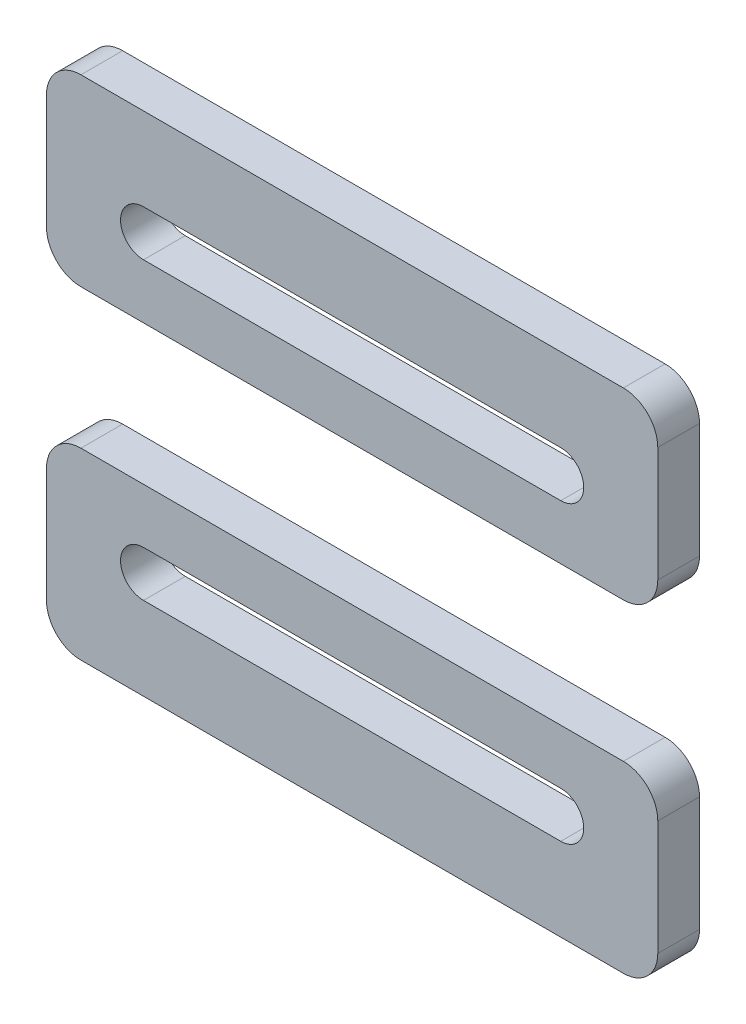
ISO-10303-21;
HEADER;
FILE_DESCRIPTION(('STEP AP214'),'2;1');
FILE_NAME('part.step','',(''),(''),'','','');
FILE_SCHEMA(('AUTOMOTIVE_DESIGN { 1 0 10303 214 1 1 1 1 }'));
ENDSEC;
DATA;
#1=APPLICATION_CONTEXT('core data for automotive mechanical design processes');
#2=APPLICATION_PROTOCOL_DEFINITION('international standard','automotive_design',2000,#1);
#3=PRODUCT_CONTEXT('',#1,'mechanical');
#4=PRODUCT('Part','Part','',(#3));
#5=PRODUCT_RELATED_PRODUCT_CATEGORY('part','',(#4));
#6=PRODUCT_DEFINITION_FORMATION('','',#4);
#7=PRODUCT_DEFINITION_CONTEXT('part definition',#1,'design');
#8=PRODUCT_DEFINITION('design','',#6,#7);
#9=PRODUCT_DEFINITION_SHAPE('','',#8);
#10=(LENGTH_UNIT() NAMED_UNIT(*) SI_UNIT(.MILLI.,.METRE.));
#11=(NAMED_UNIT(*) PLANE_ANGLE_UNIT() SI_UNIT($,.RADIAN.));
#12=(NAMED_UNIT(*) SI_UNIT($,.STERADIAN.) SOLID_ANGLE_UNIT());
#13=UNCERTAINTY_MEASURE_WITH_UNIT(LENGTH_MEASURE(1.E-05),#10,'distance_accuracy_value','');
#14=(GEOMETRIC_REPRESENTATION_CONTEXT(3) GLOBAL_UNCERTAINTY_ASSIGNED_CONTEXT((#13)) GLOBAL_UNIT_ASSIGNED_CONTEXT((#10,
#11,#12)) REPRESENTATION_CONTEXT('',''));
#15=CARTESIAN_POINT('',(0.,0.,0.));
#16=DIRECTION('',(0.,0.,1.));
#17=DIRECTION('',(1.,0.,0.));
#18=AXIS2_PLACEMENT_3D('',#15,#16,#17);
#19=CARTESIAN_POINT('',(3.21605205008121,-26.5175692714098,2.));
#20=DIRECTION('',(0.,0.,1.));
#21=DIRECTION('',(1.,0.,0.));
#22=AXIS2_PLACEMENT_3D('',#19,#20,#21);
#23=PLANE('',#22);
#24=DIRECTION('',(1.,0.,0.));
#25=VECTOR('',#24,1.);
#26=CARTESIAN_POINT('',(-19.7839470591373,-24.1875692714098,2.));
#27=LINE('',#26,#25);
#28=CARTESIAN_POINT('',(-19.7839470591373,-24.1875692714098,2.));
#29=VERTEX_POINT('',#28);
#30=CARTESIAN_POINT('',(0.216052940862726,-24.1875692714098,2.));
#31=VERTEX_POINT('',#30);
#32=EDGE_CURVE('E279',#29,#31,#27,.T.);
#33=ORIENTED_EDGE('',*,*,#32,.F.);
#34=CARTESIAN_POINT('',(-19.7839479542031,-23.0875692714098,2.));
#35=DIRECTION('',(0.,0.,1.));
#36=DIRECTION('',(1.,0.,0.));
#37=AXIS2_PLACEMENT_3D('',#34,#35,#36);
#38=CIRCLE('',#37,1.10000000000036);
#39=CARTESIAN_POINT('',(-19.7839488407003,-21.9875692714098,2.));
#40=VERTEX_POINT('',#39);
#41=EDGE_CURVE('E119',#40,#29,#38,.T.);
#42=ORIENTED_EDGE('',*,*,#41,.F.);
#43=DIRECTION('',(-1.,0.,0.));
#44=VECTOR('',#43,1.);
#45=CARTESIAN_POINT('',(0.216052940862726,-21.9875692714098,2.));
#46=LINE('',#45,#44);
#47=CARTESIAN_POINT('',(0.216052940862726,-21.9875692714098,2.));
#48=VERTEX_POINT('',#47);
#49=EDGE_CURVE('E267',#48,#40,#46,.T.);
#50=ORIENTED_EDGE('',*,*,#49,.F.);
#51=CARTESIAN_POINT('',(0.216052940862726,-23.0875692714098,2.));
#52=DIRECTION('',(0.,0.,1.));
#53=DIRECTION('',(1.,0.,0.));
#54=AXIS2_PLACEMENT_3D('',#51,#52,#53);
#55=CIRCLE('',#54,1.1);
#56=EDGE_CURVE('E277',#31,#48,#55,.T.);
#57=ORIENTED_EDGE('',*,*,#56,.F.);
#58=EDGE_LOOP('',(#33,#42,#50,#57));
#59=FACE_BOUND('',#58,.T.);
#60=CARTESIAN_POINT('',(3.21605205008121,-26.5175692714098,2.));
#61=DIRECTION('',(0.,0.,1.));
#62=DIRECTION('',(1.,0.,0.));
#63=AXIS2_PLACEMENT_3D('',#60,#61,#62);
#64=CIRCLE('',#63,1.65);
#65=CARTESIAN_POINT('',(3.21605205008121,-28.1675692714098,2.));
#66=VERTEX_POINT('',#65);
#67=CARTESIAN_POINT('',(4.8660520500812,-26.5175692714098,2.));
#68=VERTEX_POINT('',#67);
#69=EDGE_CURVE('E226',#66,#68,#64,.T.);
#70=ORIENTED_EDGE('',*,*,#69,.T.);
#71=DIRECTION('',(0.,1.,0.));
#72=VECTOR('',#71,1.);
#73=CARTESIAN_POINT('',(4.8660520500812,-26.5175692714098,2.));
#74=LINE('',#73,#72);
#75=CARTESIAN_POINT('',(4.8660520500812,-21.0175692714098,2.));
#76=VERTEX_POINT('',#75);
#77=EDGE_CURVE('E132',#68,#76,#74,.T.);
#78=ORIENTED_EDGE('',*,*,#77,.T.);
#79=CARTESIAN_POINT('',(3.21605205008121,-21.0175692714098,2.));
#80=DIRECTION('',(0.,0.,1.));
#81=DIRECTION('',(1.,0.,0.));
#82=AXIS2_PLACEMENT_3D('',#79,#80,#81);
#83=CIRCLE('',#82,1.65);
#84=CARTESIAN_POINT('',(3.2160520500812,-19.3675692714098,2.));
#85=VERTEX_POINT('',#84);
#86=EDGE_CURVE('E216',#76,#85,#83,.T.);
#87=ORIENTED_EDGE('',*,*,#86,.T.);
#88=DIRECTION('',(-1.,0.,0.));
#89=VECTOR('',#88,1.);
#90=CARTESIAN_POINT('',(3.2160520500812,-19.3675692714098,2.));
#91=LINE('',#90,#89);
#92=CARTESIAN_POINT('',(-22.7839479499188,-19.3675692714098,2.));
#93=VERTEX_POINT('',#92);
#94=EDGE_CURVE('E222',#85,#93,#91,.T.);
#95=ORIENTED_EDGE('',*,*,#94,.T.);
#96=CARTESIAN_POINT('',(-22.7839479499188,-21.0175692714098,2.));
#97=DIRECTION('',(0.,0.,1.));
#98=DIRECTION('',(1.,0.,0.));
#99=AXIS2_PLACEMENT_3D('',#96,#97,#98);
#100=CIRCLE('',#99,1.65);
#101=CARTESIAN_POINT('',(-24.4339479499188,-21.0175692714098,2.));
#102=VERTEX_POINT('',#101);
#103=EDGE_CURVE('E232',#93,#102,#100,.T.);
#104=ORIENTED_EDGE('',*,*,#103,.T.);
#105=DIRECTION('',(0.,-1.,0.));
#106=VECTOR('',#105,1.);
#107=CARTESIAN_POINT('',(-24.4339479499188,-21.0175692714098,2.));
#108=LINE('',#107,#106);
#109=CARTESIAN_POINT('',(-24.4339479499188,-26.5175692714098,2.));
#110=VERTEX_POINT('',#109);
#111=EDGE_CURVE('E235',#102,#110,#108,.T.);
#112=ORIENTED_EDGE('',*,*,#111,.T.);
#113=CARTESIAN_POINT('',(-22.7839479499188,-26.5175692714098,2.));
#114=DIRECTION('',(0.,0.,1.));
#115=DIRECTION('',(1.,0.,0.));
#116=AXIS2_PLACEMENT_3D('',#113,#114,#115);
#117=CIRCLE('',#116,1.65);
#118=CARTESIAN_POINT('',(-22.7839479499188,-28.1675692714098,2.));
#119=VERTEX_POINT('',#118);
#120=EDGE_CURVE('E238',#110,#119,#117,.T.);
#121=ORIENTED_EDGE('',*,*,#120,.T.);
#122=DIRECTION('',(1.,0.,0.));
#123=VECTOR('',#122,1.);
#124=CARTESIAN_POINT('',(-22.7839479499188,-28.1675692714098,2.));
#125=LINE('',#124,#123);
#126=EDGE_CURVE('E241',#119,#66,#125,.T.);
#127=ORIENTED_EDGE('',*,*,#126,.T.);
#128=EDGE_LOOP('',(#70,#78,#87,#95,#104,#112,#121,#127));
#129=FACE_BOUND('',#128,.T.);
#130=ADVANCED_FACE('F115',(#59,#129),#23,.T.);
#131=CARTESIAN_POINT('',(3.21605205008121,-26.5175692714098,0.));
#132=DIRECTION('',(0.,0.,1.));
#133=DIRECTION('',(1.,0.,0.));
#134=AXIS2_PLACEMENT_3D('',#131,#132,#133);
#135=PLANE('',#134);
#136=CARTESIAN_POINT('',(-19.7839479542031,-23.0875692714098,0.));
#137=DIRECTION('',(0.,0.,1.));
#138=DIRECTION('',(1.,0.,0.));
#139=AXIS2_PLACEMENT_3D('',#136,#137,#138);
#140=CIRCLE('',#139,1.10000000000036);
#141=CARTESIAN_POINT('',(-19.7839488407003,-21.9875692714098,0.));
#142=VERTEX_POINT('',#141);
#143=CARTESIAN_POINT('',(-19.7839470591373,-24.1875692714098,0.));
#144=VERTEX_POINT('',#143);
#145=EDGE_CURVE('E13',#142,#144,#140,.T.);
#146=ORIENTED_EDGE('',*,*,#145,.T.);
#147=DIRECTION('',(1.,0.,0.));
#148=VECTOR('',#147,1.);
#149=CARTESIAN_POINT('',(-19.7839470591373,-24.1875692714098,0.));
#150=LINE('',#149,#148);
#151=CARTESIAN_POINT('',(0.216052940862726,-24.1875692714098,0.));
#152=VERTEX_POINT('',#151);
#153=EDGE_CURVE('E124',#144,#152,#150,.T.);
#154=ORIENTED_EDGE('',*,*,#153,.T.);
#155=CARTESIAN_POINT('',(0.216052940862726,-23.0875692714098,0.));
#156=DIRECTION('',(0.,0.,1.));
#157=DIRECTION('',(1.,0.,0.));
#158=AXIS2_PLACEMENT_3D('',#155,#156,#157);
#159=CIRCLE('',#158,1.1);
#160=CARTESIAN_POINT('',(0.216052940862726,-21.9875692714098,0.));
#161=VERTEX_POINT('',#160);
#162=EDGE_CURVE('E271',#152,#161,#159,.T.);
#163=ORIENTED_EDGE('',*,*,#162,.T.);
#164=DIRECTION('',(-1.,0.,0.));
#165=VECTOR('',#164,1.);
#166=CARTESIAN_POINT('',(0.216052940862726,-21.9875692714098,0.));
#167=LINE('',#166,#165);
#168=EDGE_CURVE('E268',#161,#142,#167,.T.);
#169=ORIENTED_EDGE('',*,*,#168,.T.);
#170=EDGE_LOOP('',(#146,#154,#163,#169));
#171=FACE_BOUND('',#170,.T.);
#172=DIRECTION('',(0.,-1.,0.));
#173=VECTOR('',#172,1.);
#174=CARTESIAN_POINT('',(4.8660520500812,-26.5175692714098,0.));
#175=LINE('',#174,#173);
#176=CARTESIAN_POINT('',(4.8660520500812,-21.0175692714098,0.));
#177=VERTEX_POINT('',#176);
#178=CARTESIAN_POINT('',(4.8660520500812,-26.5175692714098,0.));
#179=VERTEX_POINT('',#178);
#180=EDGE_CURVE('E209',#177,#179,#175,.T.);
#181=ORIENTED_EDGE('',*,*,#180,.T.);
#182=CARTESIAN_POINT('',(3.21605205008121,-26.5175692714098,0.));
#183=DIRECTION('',(0.,0.,1.));
#184=DIRECTION('',(1.,0.,0.));
#185=AXIS2_PLACEMENT_3D('',#182,#183,#184);
#186=CIRCLE('',#185,1.65);
#187=CARTESIAN_POINT('',(3.2160520500812,-28.1675692714098,0.));
#188=VERTEX_POINT('',#187);
#189=EDGE_CURVE('E255',#179,#188,#186,.F.);
#190=ORIENTED_EDGE('',*,*,#189,.T.);
#191=DIRECTION('',(-1.,0.,0.));
#192=VECTOR('',#191,1.);
#193=CARTESIAN_POINT('',(-22.7839479499188,-28.1675692714098,0.));
#194=LINE('',#193,#192);
#195=CARTESIAN_POINT('',(-22.7839479499188,-28.1675692714098,0.));
#196=VERTEX_POINT('',#195);
#197=EDGE_CURVE('E431',#188,#196,#194,.T.);
#198=ORIENTED_EDGE('',*,*,#197,.T.);
#199=CARTESIAN_POINT('',(-22.7839479499188,-26.5175692714098,0.));
#200=DIRECTION('',(0.,0.,1.));
#201=DIRECTION('',(1.,0.,0.));
#202=AXIS2_PLACEMENT_3D('',#199,#200,#201);
#203=CIRCLE('',#202,1.65);
#204=CARTESIAN_POINT('',(-24.4339479499188,-26.5175692714098,0.));
#205=VERTEX_POINT('',#204);
#206=EDGE_CURVE('E428',#196,#205,#203,.F.);
#207=ORIENTED_EDGE('',*,*,#206,.T.);
#208=DIRECTION('',(0.,1.,0.));
#209=VECTOR('',#208,1.);
#210=CARTESIAN_POINT('',(-24.4339479499188,-21.0175692714098,0.));
#211=LINE('',#210,#209);
#212=CARTESIAN_POINT('',(-24.4339479499188,-21.0175692714098,0.));
#213=VERTEX_POINT('',#212);
#214=EDGE_CURVE('E425',#205,#213,#211,.T.);
#215=ORIENTED_EDGE('',*,*,#214,.T.);
#216=CARTESIAN_POINT('',(-22.7839479499188,-21.0175692714098,0.));
#217=DIRECTION('',(0.,0.,1.));
#218=DIRECTION('',(1.,0.,0.));
#219=AXIS2_PLACEMENT_3D('',#216,#217,#218);
#220=CIRCLE('',#219,1.65);
#221=CARTESIAN_POINT('',(-22.7839479499188,-19.3675692714098,0.));
#222=VERTEX_POINT('',#221);
#223=EDGE_CURVE('E421',#213,#222,#220,.F.);
#224=ORIENTED_EDGE('',*,*,#223,.T.);
#225=DIRECTION('',(1.,0.,0.));
#226=VECTOR('',#225,1.);
#227=CARTESIAN_POINT('',(3.2160520500812,-19.3675692714098,0.));
#228=LINE('',#227,#226);
#229=CARTESIAN_POINT('',(3.2160520500812,-19.3675692714098,0.));
#230=VERTEX_POINT('',#229);
#231=EDGE_CURVE('E419',#222,#230,#228,.T.);
#232=ORIENTED_EDGE('',*,*,#231,.T.);
#233=CARTESIAN_POINT('',(3.21605205008121,-21.0175692714098,0.));
#234=DIRECTION('',(0.,0.,1.));
#235=DIRECTION('',(1.,0.,0.));
#236=AXIS2_PLACEMENT_3D('',#233,#234,#235);
#237=CIRCLE('',#236,1.65);
#238=EDGE_CURVE('E260',#230,#177,#237,.F.);
#239=ORIENTED_EDGE('',*,*,#238,.T.);
#240=EDGE_LOOP('',(#181,#190,#198,#207,#215,#224,#232,#239));
#241=FACE_BOUND('',#240,.T.);
#242=ADVANCED_FACE('F297',(#171,#241),#135,.F.);
#243=CARTESIAN_POINT('',(-19.7839479542031,-23.0875692714098,2.));
#244=DIRECTION('',(0.,0.,-1.));
#245=DIRECTION('',(-1.,0.,0.));
#246=AXIS2_PLACEMENT_3D('',#243,#244,#245);
#247=CYLINDRICAL_SURFACE('',#246,1.10000000000036);
#248=ORIENTED_EDGE('',*,*,#145,.F.);
#249=DIRECTION('',(0.,0.,-1.));
#250=VECTOR('',#249,1.);
#251=CARTESIAN_POINT('',(-19.7839488407003,-21.9875692714098,2.));
#252=LINE('',#251,#250);
#253=EDGE_CURVE('E264',#40,#142,#252,.T.);
#254=ORIENTED_EDGE('',*,*,#253,.F.);
#255=ORIENTED_EDGE('',*,*,#41,.T.);
#256=DIRECTION('',(0.,0.,-1.));
#257=VECTOR('',#256,1.);
#258=CARTESIAN_POINT('',(-19.7839470591373,-24.1875692714098,2.));
#259=LINE('',#258,#257);
#260=EDGE_CURVE('E256',#29,#144,#259,.T.);
#261=ORIENTED_EDGE('',*,*,#260,.T.);
#262=EDGE_LOOP('',(#248,#254,#255,#261));
#263=FACE_BOUND('',#262,.T.);
#264=ADVANCED_FACE('F287',(#263),#247,.F.);
#265=CARTESIAN_POINT('',(-19.7839470591373,-24.1875692714098,2.));
#266=DIRECTION('',(0.,1.,0.));
#267=DIRECTION('',(-1.,0.,0.));
#268=AXIS2_PLACEMENT_3D('',#265,#266,#267);
#269=PLANE('',#268);
#270=ORIENTED_EDGE('',*,*,#153,.F.);
#271=ORIENTED_EDGE('',*,*,#260,.F.);
#272=ORIENTED_EDGE('',*,*,#32,.T.);
#273=DIRECTION('',(0.,0.,-1.));
#274=VECTOR('',#273,1.);
#275=CARTESIAN_POINT('',(0.216052940862726,-24.1875692714098,2.));
#276=LINE('',#275,#274);
#277=EDGE_CURVE('E259',#31,#152,#276,.T.);
#278=ORIENTED_EDGE('',*,*,#277,.T.);
#279=EDGE_LOOP('',(#270,#271,#272,#278));
#280=FACE_BOUND('',#279,.T.);
#281=ADVANCED_FACE('F290',(#280),#269,.T.);
#282=CARTESIAN_POINT('',(0.216052940862726,-23.0875692714098,2.));
#283=DIRECTION('',(0.,0.,-1.));
#284=DIRECTION('',(-1.,0.,0.));
#285=AXIS2_PLACEMENT_3D('',#282,#283,#284);
#286=CYLINDRICAL_SURFACE('',#285,1.1);
#287=ORIENTED_EDGE('',*,*,#162,.F.);
#288=ORIENTED_EDGE('',*,*,#277,.F.);
#289=ORIENTED_EDGE('',*,*,#56,.T.);
#290=DIRECTION('',(0.,0.,-1.));
#291=VECTOR('',#290,1.);
#292=CARTESIAN_POINT('',(0.216052940862726,-21.9875692714098,2.));
#293=LINE('',#292,#291);
#294=EDGE_CURVE('E262',#48,#161,#293,.T.);
#295=ORIENTED_EDGE('',*,*,#294,.T.);
#296=EDGE_LOOP('',(#287,#288,#289,#295));
#297=FACE_BOUND('',#296,.T.);
#298=ADVANCED_FACE('F294',(#297),#286,.F.);
#299=CARTESIAN_POINT('',(0.216052940862726,-21.9875692714098,2.));
#300=DIRECTION('',(0.,-1.,0.));
#301=DIRECTION('',(1.,0.,0.));
#302=AXIS2_PLACEMENT_3D('',#299,#300,#301);
#303=PLANE('',#302);
#304=ORIENTED_EDGE('',*,*,#168,.F.);
#305=ORIENTED_EDGE('',*,*,#294,.F.);
#306=ORIENTED_EDGE('',*,*,#49,.T.);
#307=ORIENTED_EDGE('',*,*,#253,.T.);
#308=EDGE_LOOP('',(#304,#305,#306,#307));
#309=FACE_BOUND('',#308,.T.);
#310=ADVANCED_FACE('F117',(#309),#303,.T.);
#311=CARTESIAN_POINT('',(4.8660520500812,-26.5175692714098,-31.4682379551191));
#312=DIRECTION('',(1.,0.,0.));
#313=DIRECTION('',(0.,1.,0.));
#314=AXIS2_PLACEMENT_3D('',#311,#312,#313);
#315=PLANE('',#314);
#316=DIRECTION('',(0.,0.,1.));
#317=VECTOR('',#316,1.);
#318=CARTESIAN_POINT('',(4.8660520500812,-21.0175692714098,-31.4682379551191));
#319=LINE('',#318,#317);
#320=EDGE_CURVE('E205',#177,#76,#319,.T.);
#321=ORIENTED_EDGE('',*,*,#320,.T.);
#322=ORIENTED_EDGE('',*,*,#77,.F.);
#323=DIRECTION('',(0.,0.,1.));
#324=VECTOR('',#323,1.);
#325=CARTESIAN_POINT('',(4.8660520500812,-26.5175692714098,-31.4682379551191));
#326=LINE('',#325,#324);
#327=EDGE_CURVE('E213',#179,#68,#326,.T.);
#328=ORIENTED_EDGE('',*,*,#327,.F.);
#329=ORIENTED_EDGE('',*,*,#180,.F.);
#330=EDGE_LOOP('',(#321,#322,#328,#329));
#331=FACE_BOUND('',#330,.T.);
#332=ADVANCED_FACE('F207',(#331),#315,.T.);
#333=CARTESIAN_POINT('',(3.21605205008121,-21.0175692714098,-31.4682379551191));
#334=DIRECTION('',(0.,0.,1.));
#335=DIRECTION('',(1.,0.,0.));
#336=AXIS2_PLACEMENT_3D('',#333,#334,#335);
#337=CYLINDRICAL_SURFACE('',#336,1.65);
#338=DIRECTION('',(0.,0.,1.));
#339=VECTOR('',#338,1.);
#340=CARTESIAN_POINT('',(3.2160520500812,-19.3675692714098,-31.4682379551191));
#341=LINE('',#340,#339);
#342=EDGE_CURVE('E212',#230,#85,#341,.T.);
#343=ORIENTED_EDGE('',*,*,#342,.T.);
#344=ORIENTED_EDGE('',*,*,#86,.F.);
#345=ORIENTED_EDGE('',*,*,#320,.F.);
#346=ORIENTED_EDGE('',*,*,#238,.F.);
#347=EDGE_LOOP('',(#343,#344,#345,#346));
#348=FACE_BOUND('',#347,.T.);
#349=ADVANCED_FACE('F217',(#348),#337,.T.);
#350=CARTESIAN_POINT('',(3.2160520500812,-19.3675692714098,-31.4682379551191));
#351=DIRECTION('',(0.,1.,0.));
#352=DIRECTION('',(-1.,0.,0.));
#353=AXIS2_PLACEMENT_3D('',#350,#351,#352);
#354=PLANE('',#353);
#355=DIRECTION('',(0.,0.,1.));
#356=VECTOR('',#355,1.);
#357=CARTESIAN_POINT('',(-22.7839479499188,-19.3675692714098,-31.4682379551191));
#358=LINE('',#357,#356);
#359=EDGE_CURVE('E250',#222,#93,#358,.T.);
#360=ORIENTED_EDGE('',*,*,#359,.T.);
#361=ORIENTED_EDGE('',*,*,#94,.F.);
#362=ORIENTED_EDGE('',*,*,#342,.F.);
#363=ORIENTED_EDGE('',*,*,#231,.F.);
#364=EDGE_LOOP('',(#360,#361,#362,#363));
#365=FACE_BOUND('',#364,.T.);
#366=ADVANCED_FACE('F354',(#365),#354,.T.);
#367=CARTESIAN_POINT('',(-22.7839479499188,-21.0175692714098,-31.4682379551191));
#368=DIRECTION('',(0.,0.,1.));
#369=DIRECTION('',(1.,0.,0.));
#370=AXIS2_PLACEMENT_3D('',#367,#368,#369);
#371=CYLINDRICAL_SURFACE('',#370,1.65);
#372=DIRECTION('',(0.,0.,1.));
#373=VECTOR('',#372,1.);
#374=CARTESIAN_POINT('',(-24.4339479499188,-21.0175692714098,-31.4682379551191));
#375=LINE('',#374,#373);
#376=EDGE_CURVE('E248',#213,#102,#375,.T.);
#377=ORIENTED_EDGE('',*,*,#376,.T.);
#378=ORIENTED_EDGE('',*,*,#103,.F.);
#379=ORIENTED_EDGE('',*,*,#359,.F.);
#380=ORIENTED_EDGE('',*,*,#223,.F.);
#381=EDGE_LOOP('',(#377,#378,#379,#380));
#382=FACE_BOUND('',#381,.T.);
#383=ADVANCED_FACE('F363',(#382),#371,.T.);
#384=CARTESIAN_POINT('',(-24.4339479499188,-21.0175692714098,-31.4682379551191));
#385=DIRECTION('',(-1.,0.,0.));
#386=DIRECTION('',(0.,-1.,0.));
#387=AXIS2_PLACEMENT_3D('',#384,#385,#386);
#388=PLANE('',#387);
#389=DIRECTION('',(0.,0.,1.));
#390=VECTOR('',#389,1.);
#391=CARTESIAN_POINT('',(-24.4339479499188,-26.5175692714098,-31.4682379551191));
#392=LINE('',#391,#390);
#393=EDGE_CURVE('E246',#205,#110,#392,.T.);
#394=ORIENTED_EDGE('',*,*,#393,.T.);
#395=ORIENTED_EDGE('',*,*,#111,.F.);
#396=ORIENTED_EDGE('',*,*,#376,.F.);
#397=ORIENTED_EDGE('',*,*,#214,.F.);
#398=EDGE_LOOP('',(#394,#395,#396,#397));
#399=FACE_BOUND('',#398,.T.);
#400=ADVANCED_FACE('F373',(#399),#388,.T.);
#401=CARTESIAN_POINT('',(-22.7839479499188,-26.5175692714098,-31.4682379551191));
#402=DIRECTION('',(0.,0.,1.));
#403=DIRECTION('',(1.,0.,0.));
#404=AXIS2_PLACEMENT_3D('',#401,#402,#403);
#405=CYLINDRICAL_SURFACE('',#404,1.65);
#406=DIRECTION('',(0.,0.,1.));
#407=VECTOR('',#406,1.);
#408=CARTESIAN_POINT('',(-22.7839479499188,-28.1675692714098,-31.4682379551191));
#409=LINE('',#408,#407);
#410=EDGE_CURVE('E244',#196,#119,#409,.T.);
#411=ORIENTED_EDGE('',*,*,#410,.T.);
#412=ORIENTED_EDGE('',*,*,#120,.F.);
#413=ORIENTED_EDGE('',*,*,#393,.F.);
#414=ORIENTED_EDGE('',*,*,#206,.F.);
#415=EDGE_LOOP('',(#411,#412,#413,#414));
#416=FACE_BOUND('',#415,.T.);
#417=ADVANCED_FACE('F383',(#416),#405,.T.);
#418=CARTESIAN_POINT('',(-22.7839479499188,-28.1675692714098,-31.4682379551191));
#419=DIRECTION('',(0.,-1.,0.));
#420=DIRECTION('',(1.,0.,0.));
#421=AXIS2_PLACEMENT_3D('',#418,#419,#420);
#422=PLANE('',#421);
#423=DIRECTION('',(0.,0.,1.));
#424=VECTOR('',#423,1.);
#425=CARTESIAN_POINT('',(3.21605205008121,-28.1675692714098,-31.4682379551191));
#426=LINE('',#425,#424);
#427=EDGE_CURVE('E140',#188,#66,#426,.T.);
#428=ORIENTED_EDGE('',*,*,#427,.T.);
#429=ORIENTED_EDGE('',*,*,#126,.F.);
#430=ORIENTED_EDGE('',*,*,#410,.F.);
#431=ORIENTED_EDGE('',*,*,#197,.F.);
#432=EDGE_LOOP('',(#428,#429,#430,#431));
#433=FACE_BOUND('',#432,.T.);
#434=ADVANCED_FACE('F393',(#433),#422,.T.);
#435=CARTESIAN_POINT('',(3.21605205008121,-26.5175692714098,-31.4682379551191));
#436=DIRECTION('',(0.,0.,1.));
#437=DIRECTION('',(1.,0.,0.));
#438=AXIS2_PLACEMENT_3D('',#435,#436,#437);
#439=CYLINDRICAL_SURFACE('',#438,1.65);
#440=ORIENTED_EDGE('',*,*,#327,.T.);
#441=ORIENTED_EDGE('',*,*,#69,.F.);
#442=ORIENTED_EDGE('',*,*,#427,.F.);
#443=ORIENTED_EDGE('',*,*,#189,.F.);
#444=EDGE_LOOP('',(#440,#441,#442,#443));
#445=FACE_BOUND('',#444,.T.);
#446=ADVANCED_FACE('F403',(#445),#439,.T.);
#447=CLOSED_SHELL('',(#130,#242,#264,#281,#298,#310,#332,#349,#366,#383,#400,#417,#434,#446));
#448=MANIFOLD_SOLID_BREP('B2',#447);
#449=CARTESIAN_POINT('',(-22.7839479499188,-5.51756927140976,2.));
#450=DIRECTION('',(0.,0.,1.));
#451=DIRECTION('',(1.,0.,0.));
#452=AXIS2_PLACEMENT_3D('',#449,#450,#451);
#453=PLANE('',#452);
#454=DIRECTION('',(1.,0.,0.));
#455=VECTOR('',#454,1.);
#456=CARTESIAN_POINT('',(-19.7839488407003,-10.0475692714098,2.));
#457=LINE('',#456,#455);
#458=CARTESIAN_POINT('',(-19.7839488407003,-10.0475692714098,2.));
#459=VERTEX_POINT('',#458);
#460=CARTESIAN_POINT('',(0.216052940862728,-10.0475692714098,2.));
#461=VERTEX_POINT('',#460);
#462=EDGE_CURVE('E590',#459,#461,#457,.T.);
#463=ORIENTED_EDGE('',*,*,#462,.F.);
#464=CARTESIAN_POINT('',(-19.7839479542031,-8.94756927140975,2.));
#465=DIRECTION('',(0.,0.,1.));
#466=DIRECTION('',(1.,0.,0.));
#467=AXIS2_PLACEMENT_3D('',#464,#465,#466);
#468=CIRCLE('',#467,1.10000000000036);
#469=CARTESIAN_POINT('',(-19.7839470591373,-7.84756927140975,2.));
#470=VERTEX_POINT('',#469);
#471=EDGE_CURVE('E588',#470,#459,#468,.T.);
#472=ORIENTED_EDGE('',*,*,#471,.F.);
#473=DIRECTION('',(-1.,0.,0.));
#474=VECTOR('',#473,1.);
#475=CARTESIAN_POINT('',(0.216052940862728,-7.84756927140976,2.));
#476=LINE('',#475,#474);
#477=CARTESIAN_POINT('',(0.216052940862726,-7.84756927140976,2.));
#478=VERTEX_POINT('',#477);
#479=EDGE_CURVE('E596',#478,#470,#476,.T.);
#480=ORIENTED_EDGE('',*,*,#479,.F.);
#481=CARTESIAN_POINT('',(0.216052940862728,-8.94756927140976,2.));
#482=DIRECTION('',(0.,0.,1.));
#483=DIRECTION('',(1.,0.,0.));
#484=AXIS2_PLACEMENT_3D('',#481,#482,#483);
#485=CIRCLE('',#484,1.1);
#486=EDGE_CURVE('E593',#461,#478,#485,.T.);
#487=ORIENTED_EDGE('',*,*,#486,.F.);
#488=EDGE_LOOP('',(#463,#472,#480,#487));
#489=FACE_BOUND('',#488,.T.);
#490=CARTESIAN_POINT('',(-22.7839479499188,-5.51756927140976,2.));
#491=DIRECTION('',(0.,0.,1.));
#492=DIRECTION('',(1.,0.,0.));
#493=AXIS2_PLACEMENT_3D('',#490,#491,#492);
#494=CIRCLE('',#493,1.65);
#495=CARTESIAN_POINT('',(-22.7839479499188,-3.86756927140976,2.));
#496=VERTEX_POINT('',#495);
#497=CARTESIAN_POINT('',(-24.4339479499188,-5.51756927140976,2.));
#498=VERTEX_POINT('',#497);
#499=EDGE_CURVE('E558',#496,#498,#494,.T.);
#500=ORIENTED_EDGE('',*,*,#499,.T.);
#501=DIRECTION('',(0.,-1.,0.));
#502=VECTOR('',#501,1.);
#503=CARTESIAN_POINT('',(-24.4339479499188,-5.51756927140976,2.));
#504=LINE('',#503,#502);
#505=CARTESIAN_POINT('',(-24.4339479499188,-11.0175692714098,2.));
#506=VERTEX_POINT('',#505);
#507=EDGE_CURVE('E464',#498,#506,#504,.T.);
#508=ORIENTED_EDGE('',*,*,#507,.T.);
#509=CARTESIAN_POINT('',(-22.7839479499188,-11.0175692714098,2.));
#510=DIRECTION('',(0.,0.,1.));
#511=DIRECTION('',(1.,0.,0.));
#512=AXIS2_PLACEMENT_3D('',#509,#510,#511);
#513=CIRCLE('',#512,1.65);
#514=CARTESIAN_POINT('',(-22.7839479499188,-12.6675692714098,2.));
#515=VERTEX_POINT('',#514);
#516=EDGE_CURVE('E548',#506,#515,#513,.T.);
#517=ORIENTED_EDGE('',*,*,#516,.T.);
#518=DIRECTION('',(1.,0.,0.));
#519=VECTOR('',#518,1.);
#520=CARTESIAN_POINT('',(-22.7839479499188,-12.6675692714098,2.));
#521=LINE('',#520,#519);
#522=CARTESIAN_POINT('',(3.2160520500812,-12.6675692714098,2.));
#523=VERTEX_POINT('',#522);
#524=EDGE_CURVE('E554',#515,#523,#521,.T.);
#525=ORIENTED_EDGE('',*,*,#524,.T.);
#526=CARTESIAN_POINT('',(3.2160520500812,-11.0175692714098,2.));
#527=DIRECTION('',(0.,0.,1.));
#528=DIRECTION('',(1.,0.,0.));
#529=AXIS2_PLACEMENT_3D('',#526,#527,#528);
#530=CIRCLE('',#529,1.65);
#531=CARTESIAN_POINT('',(4.8660520500812,-11.0175692714098,2.));
#532=VERTEX_POINT('',#531);
#533=EDGE_CURVE('E564',#523,#532,#530,.T.);
#534=ORIENTED_EDGE('',*,*,#533,.T.);
#535=DIRECTION('',(0.,1.,0.));
#536=VECTOR('',#535,1.);
#537=CARTESIAN_POINT('',(4.8660520500812,-11.0175692714098,2.));
#538=LINE('',#537,#536);
#539=CARTESIAN_POINT('',(4.8660520500812,-5.51756927140976,2.));
#540=VERTEX_POINT('',#539);
#541=EDGE_CURVE('E567',#532,#540,#538,.T.);
#542=ORIENTED_EDGE('',*,*,#541,.T.);
#543=CARTESIAN_POINT('',(3.2160520500812,-5.51756927140976,2.));
#544=DIRECTION('',(0.,0.,1.));
#545=DIRECTION('',(1.,0.,0.));
#546=AXIS2_PLACEMENT_3D('',#543,#544,#545);
#547=CIRCLE('',#546,1.65);
#548=CARTESIAN_POINT('',(3.2160520500812,-3.86756927140976,2.));
#549=VERTEX_POINT('',#548);
#550=EDGE_CURVE('E570',#540,#549,#547,.T.);
#551=ORIENTED_EDGE('',*,*,#550,.T.);
#552=DIRECTION('',(-1.,0.,0.));
#553=VECTOR('',#552,1.);
#554=CARTESIAN_POINT('',(3.2160520500812,-3.86756927140976,2.));
#555=LINE('',#554,#553);
#556=EDGE_CURVE('E573',#549,#496,#555,.T.);
#557=ORIENTED_EDGE('',*,*,#556,.T.);
#558=EDGE_LOOP('',(#500,#508,#517,#525,#534,#542,#551,#557));
#559=FACE_BOUND('',#558,.T.);
#560=ADVANCED_FACE('F449',(#489,#559),#453,.T.);
#561=CARTESIAN_POINT('',(-22.7839479499188,-5.51756927140976,0.));
#562=DIRECTION('',(0.,0.,1.));
#563=DIRECTION('',(1.,0.,0.));
#564=AXIS2_PLACEMENT_3D('',#561,#562,#563);
#565=PLANE('',#564);
#566=CARTESIAN_POINT('',(-19.7839479542031,-8.94756927140975,0.));
#567=DIRECTION('',(0.,0.,1.));
#568=DIRECTION('',(1.,0.,0.));
#569=AXIS2_PLACEMENT_3D('',#566,#567,#568);
#570=CIRCLE('',#569,1.10000000000036);
#571=CARTESIAN_POINT('',(-19.7839470591373,-7.84756927140975,0.));
#572=VERTEX_POINT('',#571);
#573=CARTESIAN_POINT('',(-19.7839488407003,-10.0475692714098,0.));
#574=VERTEX_POINT('',#573);
#575=EDGE_CURVE('E599',#572,#574,#570,.T.);
#576=ORIENTED_EDGE('',*,*,#575,.T.);
#577=DIRECTION('',(1.,0.,0.));
#578=VECTOR('',#577,1.);
#579=CARTESIAN_POINT('',(-19.7839488407003,-10.0475692714098,0.));
#580=LINE('',#579,#578);
#581=CARTESIAN_POINT('',(0.216052940862728,-10.0475692714098,0.));
#582=VERTEX_POINT('',#581);
#583=EDGE_CURVE('E602',#574,#582,#580,.T.);
#584=ORIENTED_EDGE('',*,*,#583,.T.);
#585=CARTESIAN_POINT('',(0.216052940862728,-8.94756927140976,0.));
#586=DIRECTION('',(0.,0.,1.));
#587=DIRECTION('',(1.,0.,0.));
#588=AXIS2_PLACEMENT_3D('',#585,#586,#587);
#589=CIRCLE('',#588,1.1);
#590=CARTESIAN_POINT('',(0.216052940862728,-7.84756927140976,0.));
#591=VERTEX_POINT('',#590);
#592=EDGE_CURVE('E606',#582,#591,#589,.T.);
#593=ORIENTED_EDGE('',*,*,#592,.T.);
#594=DIRECTION('',(-1.,0.,0.));
#595=VECTOR('',#594,1.);
#596=CARTESIAN_POINT('',(0.216052940862728,-7.84756927140976,0.));
#597=LINE('',#596,#595);
#598=EDGE_CURVE('E591',#591,#572,#597,.T.);
#599=ORIENTED_EDGE('',*,*,#598,.T.);
#600=EDGE_LOOP('',(#576,#584,#593,#599));
#601=FACE_BOUND('',#600,.T.);
#602=DIRECTION('',(0.,1.,0.));
#603=VECTOR('',#602,1.);
#604=CARTESIAN_POINT('',(-24.4339479499188,-5.51756927140976,0.));
#605=LINE('',#604,#603);
#606=CARTESIAN_POINT('',(-24.4339479499188,-11.0175692714098,0.));
#607=VERTEX_POINT('',#606);
#608=CARTESIAN_POINT('',(-24.4339479499188,-5.51756927140976,0.));
#609=VERTEX_POINT('',#608);
#610=EDGE_CURVE('E541',#607,#609,#605,.T.);
#611=ORIENTED_EDGE('',*,*,#610,.T.);
#612=CARTESIAN_POINT('',(-22.7839479499188,-5.51756927140976,0.));
#613=DIRECTION('',(0.,0.,1.));
#614=DIRECTION('',(1.,0.,0.));
#615=AXIS2_PLACEMENT_3D('',#612,#613,#614);
#616=CIRCLE('',#615,1.65);
#617=CARTESIAN_POINT('',(-22.7839479499188,-3.86756927140976,0.));
#618=VERTEX_POINT('',#617);
#619=EDGE_CURVE('E587',#609,#618,#616,.F.);
#620=ORIENTED_EDGE('',*,*,#619,.T.);
#621=DIRECTION('',(1.,0.,0.));
#622=VECTOR('',#621,1.);
#623=CARTESIAN_POINT('',(3.2160520500812,-3.86756927140976,0.));
#624=LINE('',#623,#622);
#625=CARTESIAN_POINT('',(3.2160520500812,-3.86756927140976,0.));
#626=VERTEX_POINT('',#625);
#627=EDGE_CURVE('E678',#618,#626,#624,.T.);
#628=ORIENTED_EDGE('',*,*,#627,.T.);
#629=CARTESIAN_POINT('',(3.2160520500812,-5.51756927140976,0.));
#630=DIRECTION('',(0.,0.,1.));
#631=DIRECTION('',(1.,0.,0.));
#632=AXIS2_PLACEMENT_3D('',#629,#630,#631);
#633=CIRCLE('',#632,1.65);
#634=CARTESIAN_POINT('',(4.8660520500812,-5.51756927140976,0.));
#635=VERTEX_POINT('',#634);
#636=EDGE_CURVE('E684',#626,#635,#633,.F.);
#637=ORIENTED_EDGE('',*,*,#636,.T.);
#638=DIRECTION('',(0.,-1.,0.));
#639=VECTOR('',#638,1.);
#640=CARTESIAN_POINT('',(4.8660520500812,-11.0175692714098,0.));
#641=LINE('',#640,#639);
#642=CARTESIAN_POINT('',(4.8660520500812,-11.0175692714098,0.));
#643=VERTEX_POINT('',#642);
#644=EDGE_CURVE('E687',#635,#643,#641,.T.);
#645=ORIENTED_EDGE('',*,*,#644,.T.);
#646=CARTESIAN_POINT('',(3.2160520500812,-11.0175692714098,0.));
#647=DIRECTION('',(0.,0.,1.));
#648=DIRECTION('',(1.,0.,0.));
#649=AXIS2_PLACEMENT_3D('',#646,#647,#648);
#650=CIRCLE('',#649,1.65);
#651=CARTESIAN_POINT('',(3.2160520500812,-12.6675692714098,0.));
#652=VERTEX_POINT('',#651);
#653=EDGE_CURVE('E691',#643,#652,#650,.F.);
#654=ORIENTED_EDGE('',*,*,#653,.T.);
#655=DIRECTION('',(-1.,0.,0.));
#656=VECTOR('',#655,1.);
#657=CARTESIAN_POINT('',(-22.7839479499188,-12.6675692714098,0.));
#658=LINE('',#657,#656);
#659=CARTESIAN_POINT('',(-22.7839479499188,-12.6675692714098,0.));
#660=VERTEX_POINT('',#659);
#661=EDGE_CURVE('E694',#652,#660,#658,.T.);
#662=ORIENTED_EDGE('',*,*,#661,.T.);
#663=CARTESIAN_POINT('',(-22.7839479499188,-11.0175692714098,0.));
#664=DIRECTION('',(0.,0.,1.));
#665=DIRECTION('',(1.,0.,0.));
#666=AXIS2_PLACEMENT_3D('',#663,#664,#665);
#667=CIRCLE('',#666,1.65);
#668=EDGE_CURVE('E603',#660,#607,#667,.F.);
#669=ORIENTED_EDGE('',*,*,#668,.T.);
#670=EDGE_LOOP('',(#611,#620,#628,#637,#645,#654,#662,#669));
#671=FACE_BOUND('',#670,.T.);
#672=ADVANCED_FACE('F451',(#601,#671),#565,.F.);
#673=CARTESIAN_POINT('',(-19.7839479542031,-8.94756927140975,2.));
#674=DIRECTION('',(0.,0.,-1.));
#675=DIRECTION('',(-1.,0.,0.));
#676=AXIS2_PLACEMENT_3D('',#673,#674,#675);
#677=CYLINDRICAL_SURFACE('',#676,1.10000000000036);
#678=ORIENTED_EDGE('',*,*,#575,.F.);
#679=DIRECTION('',(0.,0.,-1.));
#680=VECTOR('',#679,1.);
#681=CARTESIAN_POINT('',(-19.7839470591373,-7.84756927140975,2.));
#682=LINE('',#681,#680);
#683=EDGE_CURVE('E598',#470,#572,#682,.T.);
#684=ORIENTED_EDGE('',*,*,#683,.F.);
#685=ORIENTED_EDGE('',*,*,#471,.T.);
#686=DIRECTION('',(0.,0.,-1.));
#687=VECTOR('',#686,1.);
#688=CARTESIAN_POINT('',(-19.7839488407003,-10.0475692714098,2.));
#689=LINE('',#688,#687);
#690=EDGE_CURVE('E113',#459,#574,#689,.T.);
#691=ORIENTED_EDGE('',*,*,#690,.T.);
#692=EDGE_LOOP('',(#678,#684,#685,#691));
#693=FACE_BOUND('',#692,.T.);
#694=ADVANCED_FACE('F628',(#693),#677,.F.);
#695=CARTESIAN_POINT('',(-19.7839488407003,-10.0475692714098,2.));
#696=DIRECTION('',(0.,1.,0.));
#697=DIRECTION('',(-1.,0.,0.));
#698=AXIS2_PLACEMENT_3D('',#695,#696,#697);
#699=PLANE('',#698);
#700=ORIENTED_EDGE('',*,*,#583,.F.);
#701=ORIENTED_EDGE('',*,*,#690,.F.);
#702=ORIENTED_EDGE('',*,*,#462,.T.);
#703=DIRECTION('',(0.,0.,-1.));
#704=VECTOR('',#703,1.);
#705=CARTESIAN_POINT('',(0.216052940862728,-10.0475692714098,2.));
#706=LINE('',#705,#704);
#707=EDGE_CURVE('E457',#461,#582,#706,.T.);
#708=ORIENTED_EDGE('',*,*,#707,.T.);
#709=EDGE_LOOP('',(#700,#701,#702,#708));
#710=FACE_BOUND('',#709,.T.);
#711=ADVANCED_FACE('F617',(#710),#699,.T.);
#712=CARTESIAN_POINT('',(0.216052940862728,-8.94756927140976,2.));
#713=DIRECTION('',(0.,0.,-1.));
#714=DIRECTION('',(-1.,0.,0.));
#715=AXIS2_PLACEMENT_3D('',#712,#713,#714);
#716=CYLINDRICAL_SURFACE('',#715,1.1);
#717=ORIENTED_EDGE('',*,*,#592,.F.);
#718=ORIENTED_EDGE('',*,*,#707,.F.);
#719=ORIENTED_EDGE('',*,*,#486,.T.);
#720=DIRECTION('',(0.,0.,-1.));
#721=VECTOR('',#720,1.);
#722=CARTESIAN_POINT('',(0.216052940862728,-7.84756927140976,2.));
#723=LINE('',#722,#721);
#724=EDGE_CURVE('E613',#478,#591,#723,.T.);
#725=ORIENTED_EDGE('',*,*,#724,.T.);
#726=EDGE_LOOP('',(#717,#718,#719,#725));
#727=FACE_BOUND('',#726,.T.);
#728=ADVANCED_FACE('F622',(#727),#716,.F.);
#729=CARTESIAN_POINT('',(0.216052940862728,-7.84756927140976,2.));
#730=DIRECTION('',(0.,-1.,0.));
#731=DIRECTION('',(1.,0.,0.));
#732=AXIS2_PLACEMENT_3D('',#729,#730,#731);
#733=PLANE('',#732);
#734=ORIENTED_EDGE('',*,*,#598,.F.);
#735=ORIENTED_EDGE('',*,*,#724,.F.);
#736=ORIENTED_EDGE('',*,*,#479,.T.);
#737=ORIENTED_EDGE('',*,*,#683,.T.);
#738=EDGE_LOOP('',(#734,#735,#736,#737));
#739=FACE_BOUND('',#738,.T.);
#740=ADVANCED_FACE('F631',(#739),#733,.T.);
#741=CARTESIAN_POINT('',(-24.4339479499188,-5.51756927140976,-31.4682379551191));
#742=DIRECTION('',(-1.,0.,0.));
#743=DIRECTION('',(0.,-1.,0.));
#744=AXIS2_PLACEMENT_3D('',#741,#742,#743);
#745=PLANE('',#744);
#746=DIRECTION('',(0.,0.,1.));
#747=VECTOR('',#746,1.);
#748=CARTESIAN_POINT('',(-24.4339479499188,-11.0175692714098,-31.4682379551191));
#749=LINE('',#748,#747);
#750=EDGE_CURVE('E537',#607,#506,#749,.T.);
#751=ORIENTED_EDGE('',*,*,#750,.T.);
#752=ORIENTED_EDGE('',*,*,#507,.F.);
#753=DIRECTION('',(0.,0.,1.));
#754=VECTOR('',#753,1.);
#755=CARTESIAN_POINT('',(-24.4339479499188,-5.51756927140976,-31.4682379551191));
#756=LINE('',#755,#754);
#757=EDGE_CURVE('E545',#609,#498,#756,.T.);
#758=ORIENTED_EDGE('',*,*,#757,.F.);
#759=ORIENTED_EDGE('',*,*,#610,.F.);
#760=EDGE_LOOP('',(#751,#752,#758,#759));
#761=FACE_BOUND('',#760,.T.);
#762=ADVANCED_FACE('F539',(#761),#745,.T.);
#763=CARTESIAN_POINT('',(-22.7839479499188,-11.0175692714098,-31.4682379551191));
#764=DIRECTION('',(0.,0.,1.));
#765=DIRECTION('',(1.,0.,0.));
#766=AXIS2_PLACEMENT_3D('',#763,#764,#765);
#767=CYLINDRICAL_SURFACE('',#766,1.65);
#768=DIRECTION('',(0.,0.,1.));
#769=VECTOR('',#768,1.);
#770=CARTESIAN_POINT('',(-22.7839479499188,-12.6675692714098,-31.4682379551191));
#771=LINE('',#770,#769);
#772=EDGE_CURVE('E544',#660,#515,#771,.T.);
#773=ORIENTED_EDGE('',*,*,#772,.T.);
#774=ORIENTED_EDGE('',*,*,#516,.F.);
#775=ORIENTED_EDGE('',*,*,#750,.F.);
#776=ORIENTED_EDGE('',*,*,#668,.F.);
#777=EDGE_LOOP('',(#773,#774,#775,#776));
#778=FACE_BOUND('',#777,.T.);
#779=ADVANCED_FACE('F549',(#778),#767,.T.);
#780=CARTESIAN_POINT('',(-22.7839479499188,-12.6675692714098,-31.4682379551191));
#781=DIRECTION('',(0.,-1.,0.));
#782=DIRECTION('',(1.,0.,0.));
#783=AXIS2_PLACEMENT_3D('',#780,#781,#782);
#784=PLANE('',#783);
#785=DIRECTION('',(0.,0.,1.));
#786=VECTOR('',#785,1.);
#787=CARTESIAN_POINT('',(3.2160520500812,-12.6675692714098,-31.4682379551191));
#788=LINE('',#787,#786);
#789=EDGE_CURVE('E582',#652,#523,#788,.T.);
#790=ORIENTED_EDGE('',*,*,#789,.T.);
#791=ORIENTED_EDGE('',*,*,#524,.F.);
#792=ORIENTED_EDGE('',*,*,#772,.F.);
#793=ORIENTED_EDGE('',*,*,#661,.F.);
#794=EDGE_LOOP('',(#790,#791,#792,#793));
#795=FACE_BOUND('',#794,.T.);
#796=ADVANCED_FACE('F655',(#795),#784,.T.);
#797=CARTESIAN_POINT('',(3.2160520500812,-11.0175692714098,-31.4682379551191));
#798=DIRECTION('',(0.,0.,1.));
#799=DIRECTION('',(1.,0.,0.));
#800=AXIS2_PLACEMENT_3D('',#797,#798,#799);
#801=CYLINDRICAL_SURFACE('',#800,1.65);
#802=DIRECTION('',(0.,0.,1.));
#803=VECTOR('',#802,1.);
#804=CARTESIAN_POINT('',(4.8660520500812,-11.0175692714098,-31.4682379551191));
#805=LINE('',#804,#803);
#806=EDGE_CURVE('E580',#643,#532,#805,.T.);
#807=ORIENTED_EDGE('',*,*,#806,.T.);
#808=ORIENTED_EDGE('',*,*,#533,.F.);
#809=ORIENTED_EDGE('',*,*,#789,.F.);
#810=ORIENTED_EDGE('',*,*,#653,.F.);
#811=EDGE_LOOP('',(#807,#808,#809,#810));
#812=FACE_BOUND('',#811,.T.);
#813=ADVANCED_FACE('F658',(#812),#801,.T.);
#814=CARTESIAN_POINT('',(4.8660520500812,-11.0175692714098,-31.4682379551191));
#815=DIRECTION('',(1.,0.,0.));
#816=DIRECTION('',(0.,0.,-1.));
#817=AXIS2_PLACEMENT_3D('',#814,#815,#816);
#818=PLANE('',#817);
#819=DIRECTION('',(0.,0.,1.));
#820=VECTOR('',#819,1.);
#821=CARTESIAN_POINT('',(4.8660520500812,-5.51756927140976,-31.4682379551191));
#822=LINE('',#821,#820);
#823=EDGE_CURVE('E578',#635,#540,#822,.T.);
#824=ORIENTED_EDGE('',*,*,#823,.T.);
#825=ORIENTED_EDGE('',*,*,#541,.F.);
#826=ORIENTED_EDGE('',*,*,#806,.F.);
#827=ORIENTED_EDGE('',*,*,#644,.F.);
#828=EDGE_LOOP('',(#824,#825,#826,#827));
#829=FACE_BOUND('',#828,.T.);
#830=ADVANCED_FACE('F662',(#829),#818,.T.);
#831=CARTESIAN_POINT('',(3.2160520500812,-5.51756927140976,-31.4682379551191));
#832=DIRECTION('',(0.,0.,1.));
#833=DIRECTION('',(1.,0.,0.));
#834=AXIS2_PLACEMENT_3D('',#831,#832,#833);
#835=CYLINDRICAL_SURFACE('',#834,1.65);
#836=DIRECTION('',(0.,0.,1.));
#837=VECTOR('',#836,1.);
#838=CARTESIAN_POINT('',(3.2160520500812,-3.86756927140976,-31.4682379551191));
#839=LINE('',#838,#837);
#840=EDGE_CURVE('E576',#626,#549,#839,.T.);
#841=ORIENTED_EDGE('',*,*,#840,.T.);
#842=ORIENTED_EDGE('',*,*,#550,.F.);
#843=ORIENTED_EDGE('',*,*,#823,.F.);
#844=ORIENTED_EDGE('',*,*,#636,.F.);
#845=EDGE_LOOP('',(#841,#842,#843,#844));
#846=FACE_BOUND('',#845,.T.);
#847=ADVANCED_FACE('F666',(#846),#835,.T.);
#848=CARTESIAN_POINT('',(3.2160520500812,-3.86756927140976,-31.4682379551191));
#849=DIRECTION('',(0.,1.,0.));
#850=DIRECTION('',(-1.,0.,0.));
#851=AXIS2_PLACEMENT_3D('',#848,#849,#850);
#852=PLANE('',#851);
#853=DIRECTION('',(0.,0.,1.));
#854=VECTOR('',#853,1.);
#855=CARTESIAN_POINT('',(-22.7839479499188,-3.86756927140976,-31.4682379551191));
#856=LINE('',#855,#854);
#857=EDGE_CURVE('E472',#618,#496,#856,.T.);
#858=ORIENTED_EDGE('',*,*,#857,.T.);
#859=ORIENTED_EDGE('',*,*,#556,.F.);
#860=ORIENTED_EDGE('',*,*,#840,.F.);
#861=ORIENTED_EDGE('',*,*,#627,.F.);
#862=EDGE_LOOP('',(#858,#859,#860,#861));
#863=FACE_BOUND('',#862,.T.);
#864=ADVANCED_FACE('F650',(#863),#852,.T.);
#865=CARTESIAN_POINT('',(-22.7839479499188,-5.51756927140976,-31.4682379551191));
#866=DIRECTION('',(0.,0.,1.));
#867=DIRECTION('',(1.,0.,0.));
#868=AXIS2_PLACEMENT_3D('',#865,#866,#867);
#869=CYLINDRICAL_SURFACE('',#868,1.65);
#870=ORIENTED_EDGE('',*,*,#757,.T.);
#871=ORIENTED_EDGE('',*,*,#499,.F.);
#872=ORIENTED_EDGE('',*,*,#857,.F.);
#873=ORIENTED_EDGE('',*,*,#619,.F.);
#874=EDGE_LOOP('',(#870,#871,#872,#873));
#875=FACE_BOUND('',#874,.T.);
#876=ADVANCED_FACE('F647',(#875),#869,.T.);
#877=CLOSED_SHELL('',(#560,#672,#694,#711,#728,#740,#762,#779,#796,#813,#830,#847,#864,#876));
#878=MANIFOLD_SOLID_BREP('B7',#877);
#879=ADVANCED_BREP_SHAPE_REPRESENTATION('',(#18,#448,#878),#14);
#880=SHAPE_DEFINITION_REPRESENTATION(#9,#879);
ENDSEC;
END-ISO-10303-21;
